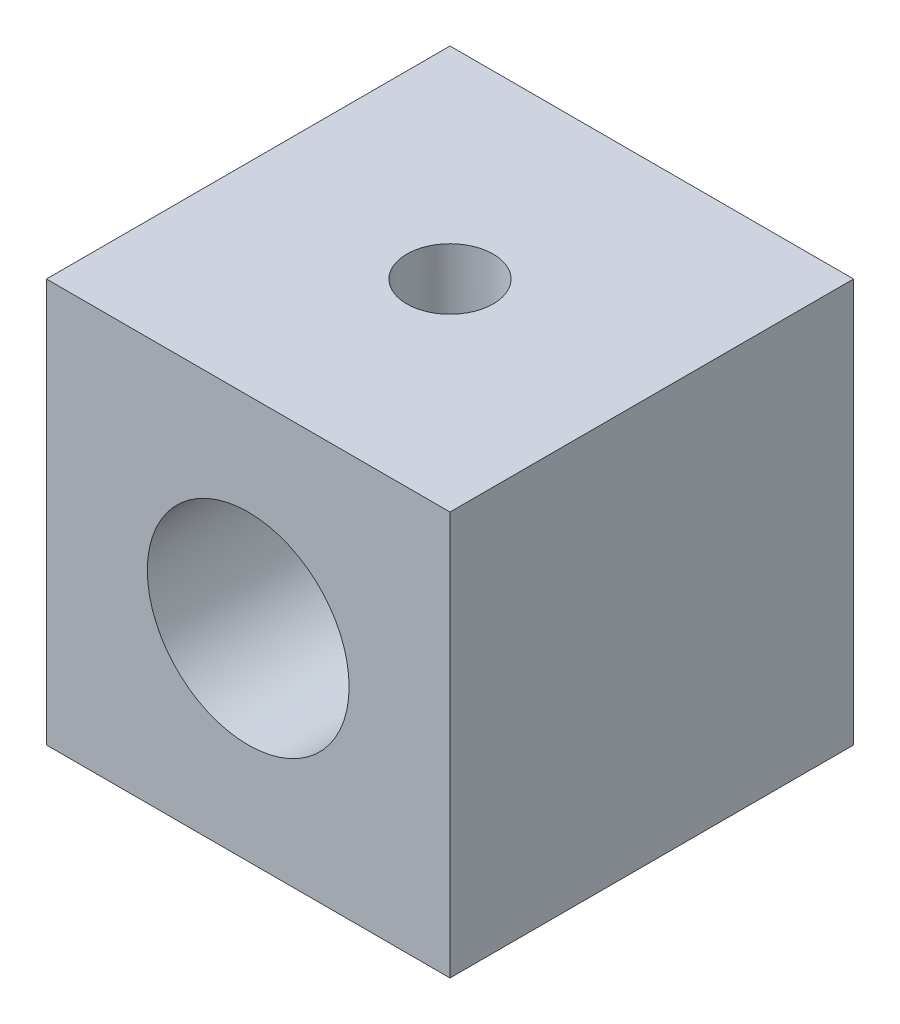
ISO-10303-21;
HEADER;
FILE_DESCRIPTION(('STEP AP214'),'2;1');
FILE_NAME('part.step','',(''),(''),'','','');
FILE_SCHEMA(('AUTOMOTIVE_DESIGN { 1 0 10303 214 1 1 1 1 }'));
ENDSEC;
DATA;
#1=APPLICATION_CONTEXT('core data for automotive mechanical design processes');
#2=APPLICATION_PROTOCOL_DEFINITION('international standard','automotive_design',2000,#1);
#3=PRODUCT_CONTEXT('',#1,'mechanical');
#4=PRODUCT('Part','Part','',(#3));
#5=PRODUCT_RELATED_PRODUCT_CATEGORY('part','',(#4));
#6=PRODUCT_DEFINITION_FORMATION('','',#4);
#7=PRODUCT_DEFINITION_CONTEXT('part definition',#1,'design');
#8=PRODUCT_DEFINITION('design','',#6,#7);
#9=PRODUCT_DEFINITION_SHAPE('','',#8);
#10=(LENGTH_UNIT() NAMED_UNIT(*) SI_UNIT(.MILLI.,.METRE.));
#11=(NAMED_UNIT(*) PLANE_ANGLE_UNIT() SI_UNIT($,.RADIAN.));
#12=(NAMED_UNIT(*) SI_UNIT($,.STERADIAN.) SOLID_ANGLE_UNIT());
#13=UNCERTAINTY_MEASURE_WITH_UNIT(LENGTH_MEASURE(1.E-05),#10,'distance_accuracy_value','');
#14=(GEOMETRIC_REPRESENTATION_CONTEXT(3) GLOBAL_UNCERTAINTY_ASSIGNED_CONTEXT((#13)) GLOBAL_UNIT_ASSIGNED_CONTEXT((#10,
#11,#12)) REPRESENTATION_CONTEXT('',''));
#15=CARTESIAN_POINT('',(0.,0.,0.));
#16=DIRECTION('',(0.,0.,1.));
#17=DIRECTION('',(1.,0.,0.));
#18=AXIS2_PLACEMENT_3D('',#15,#16,#17);
#19=CARTESIAN_POINT('',(0.,0.,40.));
#20=DIRECTION('',(0.,0.,-1.));
#21=DIRECTION('',(-1.,0.,0.));
#22=AXIS2_PLACEMENT_3D('',#19,#20,#21);
#23=PLANE('',#22);
#24=DIRECTION('',(0.,-1.,0.));
#25=VECTOR('',#24,1.);
#26=CARTESIAN_POINT('',(-20.,20.,40.));
#27=LINE('',#26,#25);
#28=CARTESIAN_POINT('',(-20.,20.,40.));
#29=VERTEX_POINT('',#28);
#30=CARTESIAN_POINT('',(-20.,-20.,40.));
#31=VERTEX_POINT('',#30);
#32=EDGE_CURVE('E91',#29,#31,#27,.T.);
#33=ORIENTED_EDGE('',*,*,#32,.T.);
#34=DIRECTION('',(1.,0.,0.));
#35=VECTOR('',#34,1.);
#36=CARTESIAN_POINT('',(20.,-20.,40.));
#37=LINE('',#36,#35);
#38=CARTESIAN_POINT('',(20.,-20.,40.));
#39=VERTEX_POINT('',#38);
#40=EDGE_CURVE('E86',#31,#39,#37,.T.);
#41=ORIENTED_EDGE('',*,*,#40,.T.);
#42=DIRECTION('',(0.,1.,0.));
#43=VECTOR('',#42,1.);
#44=CARTESIAN_POINT('',(20.,20.,40.));
#45=LINE('',#44,#43);
#46=CARTESIAN_POINT('',(20.,20.,40.));
#47=VERTEX_POINT('',#46);
#48=EDGE_CURVE('E89',#39,#47,#45,.T.);
#49=ORIENTED_EDGE('',*,*,#48,.T.);
#50=DIRECTION('',(-1.,0.,0.));
#51=VECTOR('',#50,1.);
#52=CARTESIAN_POINT('',(20.,20.,40.));
#53=LINE('',#52,#51);
#54=EDGE_CURVE('E56',#47,#29,#53,.T.);
#55=ORIENTED_EDGE('',*,*,#54,.T.);
#56=EDGE_LOOP('',(#33,#41,#49,#55));
#57=FACE_BOUND('',#56,.T.);
#58=CARTESIAN_POINT('',(0.,0.,40.));
#59=DIRECTION('',(0.,0.,1.));
#60=DIRECTION('',(1.,0.,0.));
#61=AXIS2_PLACEMENT_3D('',#58,#59,#60);
#62=CIRCLE('',#61,10.);
#63=CARTESIAN_POINT('',(10.,0.,40.));
#64=VERTEX_POINT('',#63);
#65=EDGE_CURVE('E107',#64,#64,#62,.T.);
#66=ORIENTED_EDGE('',*,*,#65,.F.);
#67=EDGE_LOOP('',(#66));
#68=FACE_BOUND('',#67,.T.);
#69=ADVANCED_FACE('F33',(#57,#68),#23,.F.);
#70=CARTESIAN_POINT('',(0.,0.,0.));
#71=DIRECTION('',(0.,0.,-1.));
#72=DIRECTION('',(-1.,0.,0.));
#73=AXIS2_PLACEMENT_3D('',#70,#71,#72);
#74=PLANE('',#73);
#75=DIRECTION('',(0.,-1.,0.));
#76=VECTOR('',#75,1.);
#77=CARTESIAN_POINT('',(-20.,20.,0.));
#78=LINE('',#77,#76);
#79=CARTESIAN_POINT('',(-20.,20.,0.));
#80=VERTEX_POINT('',#79);
#81=CARTESIAN_POINT('',(-20.,-20.,0.));
#82=VERTEX_POINT('',#81);
#83=EDGE_CURVE('E104',#80,#82,#78,.T.);
#84=ORIENTED_EDGE('',*,*,#83,.F.);
#85=DIRECTION('',(-1.,0.,0.));
#86=VECTOR('',#85,1.);
#87=CARTESIAN_POINT('',(20.,20.,0.));
#88=LINE('',#87,#86);
#89=CARTESIAN_POINT('',(20.,20.,0.));
#90=VERTEX_POINT('',#89);
#91=EDGE_CURVE('E79',#90,#80,#88,.T.);
#92=ORIENTED_EDGE('',*,*,#91,.F.);
#93=DIRECTION('',(0.,1.,0.));
#94=VECTOR('',#93,1.);
#95=CARTESIAN_POINT('',(20.,20.,0.));
#96=LINE('',#95,#94);
#97=CARTESIAN_POINT('',(20.,-20.,0.));
#98=VERTEX_POINT('',#97);
#99=EDGE_CURVE('E73',#98,#90,#96,.T.);
#100=ORIENTED_EDGE('',*,*,#99,.F.);
#101=DIRECTION('',(1.,0.,0.));
#102=VECTOR('',#101,1.);
#103=CARTESIAN_POINT('',(20.,-20.,0.));
#104=LINE('',#103,#102);
#105=EDGE_CURVE('E95',#82,#98,#104,.T.);
#106=ORIENTED_EDGE('',*,*,#105,.F.);
#107=EDGE_LOOP('',(#84,#92,#100,#106));
#108=FACE_BOUND('',#107,.T.);
#109=CARTESIAN_POINT('',(0.,0.,0.));
#110=DIRECTION('',(0.,0.,1.));
#111=DIRECTION('',(1.,0.,0.));
#112=AXIS2_PLACEMENT_3D('',#109,#110,#111);
#113=CIRCLE('',#112,10.);
#114=CARTESIAN_POINT('',(10.,0.,0.));
#115=VERTEX_POINT('',#114);
#116=EDGE_CURVE('E163',#115,#115,#113,.T.);
#117=ORIENTED_EDGE('',*,*,#116,.T.);
#118=EDGE_LOOP('',(#117));
#119=FACE_BOUND('',#118,.T.);
#120=ADVANCED_FACE('F136',(#108,#119),#74,.T.);
#121=CARTESIAN_POINT('',(-20.,20.,40.));
#122=DIRECTION('',(1.,0.,0.));
#123=DIRECTION('',(0.,1.,0.));
#124=AXIS2_PLACEMENT_3D('',#121,#122,#123);
#125=PLANE('',#124);
#126=ORIENTED_EDGE('',*,*,#83,.T.);
#127=DIRECTION('',(0.,0.,-1.));
#128=VECTOR('',#127,1.);
#129=CARTESIAN_POINT('',(-20.,-20.,40.));
#130=LINE('',#129,#128);
#131=EDGE_CURVE('E11',#31,#82,#130,.T.);
#132=ORIENTED_EDGE('',*,*,#131,.F.);
#133=ORIENTED_EDGE('',*,*,#32,.F.);
#134=DIRECTION('',(0.,0.,-1.));
#135=VECTOR('',#134,1.);
#136=CARTESIAN_POINT('',(-20.,20.,40.));
#137=LINE('',#136,#135);
#138=EDGE_CURVE('E100',#29,#80,#137,.T.);
#139=ORIENTED_EDGE('',*,*,#138,.T.);
#140=EDGE_LOOP('',(#126,#132,#133,#139));
#141=FACE_BOUND('',#140,.T.);
#142=ADVANCED_FACE('F35',(#141),#125,.F.);
#143=CARTESIAN_POINT('',(20.,-20.,40.));
#144=DIRECTION('',(0.,1.,0.));
#145=DIRECTION('',(-1.,0.,0.));
#146=AXIS2_PLACEMENT_3D('',#143,#144,#145);
#147=PLANE('',#146);
#148=CARTESIAN_POINT('',(0.,-20.,20.));
#149=DIRECTION('',(0.,-1.,0.));
#150=DIRECTION('',(1.,0.,0.));
#151=AXIS2_PLACEMENT_3D('',#148,#149,#150);
#152=CIRCLE('',#151,4.28355343391435);
#153=CARTESIAN_POINT('',(4.28355343391435,-20.,20.));
#154=VERTEX_POINT('',#153);
#155=EDGE_CURVE('E156',#154,#154,#152,.T.);
#156=ORIENTED_EDGE('',*,*,#155,.F.);
#157=EDGE_LOOP('',(#156));
#158=FACE_BOUND('',#157,.T.);
#159=ORIENTED_EDGE('',*,*,#105,.T.);
#160=DIRECTION('',(0.,0.,-1.));
#161=VECTOR('',#160,1.);
#162=CARTESIAN_POINT('',(20.,-20.,40.));
#163=LINE('',#162,#161);
#164=EDGE_CURVE('E47',#39,#98,#163,.T.);
#165=ORIENTED_EDGE('',*,*,#164,.F.);
#166=ORIENTED_EDGE('',*,*,#40,.F.);
#167=ORIENTED_EDGE('',*,*,#131,.T.);
#168=EDGE_LOOP('',(#159,#165,#166,#167));
#169=FACE_BOUND('',#168,.T.);
#170=ADVANCED_FACE('F94',(#158,#169),#147,.F.);
#171=CARTESIAN_POINT('',(20.,20.,40.));
#172=DIRECTION('',(-1.,0.,0.));
#173=DIRECTION('',(0.,-1.,0.));
#174=AXIS2_PLACEMENT_3D('',#171,#172,#173);
#175=PLANE('',#174);
#176=ORIENTED_EDGE('',*,*,#99,.T.);
#177=DIRECTION('',(0.,0.,-1.));
#178=VECTOR('',#177,1.);
#179=CARTESIAN_POINT('',(20.,20.,40.));
#180=LINE('',#179,#178);
#181=EDGE_CURVE('E96',#47,#90,#180,.T.);
#182=ORIENTED_EDGE('',*,*,#181,.F.);
#183=ORIENTED_EDGE('',*,*,#48,.F.);
#184=ORIENTED_EDGE('',*,*,#164,.T.);
#185=EDGE_LOOP('',(#176,#182,#183,#184));
#186=FACE_BOUND('',#185,.T.);
#187=ADVANCED_FACE('F98',(#186),#175,.F.);
#188=CARTESIAN_POINT('',(20.,20.,40.));
#189=DIRECTION('',(0.,-1.,0.));
#190=DIRECTION('',(1.,0.,0.));
#191=AXIS2_PLACEMENT_3D('',#188,#189,#190);
#192=PLANE('',#191);
#193=CARTESIAN_POINT('',(0.,20.,20.));
#194=DIRECTION('',(0.,-1.,0.));
#195=DIRECTION('',(1.,0.,0.));
#196=AXIS2_PLACEMENT_3D('',#193,#194,#195);
#197=CIRCLE('',#196,4.28355343391435);
#198=CARTESIAN_POINT('',(4.28355343391434,20.,20.));
#199=VERTEX_POINT('',#198);
#200=EDGE_CURVE('E116',#199,#199,#197,.T.);
#201=ORIENTED_EDGE('',*,*,#200,.T.);
#202=EDGE_LOOP('',(#201));
#203=FACE_BOUND('',#202,.T.);
#204=ORIENTED_EDGE('',*,*,#91,.T.);
#205=ORIENTED_EDGE('',*,*,#138,.F.);
#206=ORIENTED_EDGE('',*,*,#54,.F.);
#207=ORIENTED_EDGE('',*,*,#181,.T.);
#208=EDGE_LOOP('',(#204,#205,#206,#207));
#209=FACE_BOUND('',#208,.T.);
#210=ADVANCED_FACE('F132',(#203,#209),#192,.F.);
#211=CARTESIAN_POINT('',(0.,0.,40.));
#212=DIRECTION('',(0.,0.,-1.));
#213=DIRECTION('',(-1.,0.,0.));
#214=AXIS2_PLACEMENT_3D('',#211,#212,#213);
#215=CYLINDRICAL_SURFACE('',#214,10.);
#216=CARTESIAN_POINT('',(4.28355343391434,9.03610369455778,20.));
#217=CARTESIAN_POINT('',(4.28355254150128,9.03610463577456,20.1139492685976));
#218=CARTESIAN_POINT('',(4.27899979129568,9.03826672519458,20.2279354825384));
#219=CARTESIAN_POINT('',(4.26083755572342,9.04684256635532,20.455071242686));
#220=CARTESIAN_POINT('',(4.24722237364994,9.05325899239139,20.568220217334));
#221=CARTESIAN_POINT('',(4.21104813085097,9.07014190478527,20.7930219289305));
#222=CARTESIAN_POINT('',(4.188470645432,9.08061673333261,20.9046710906413));
#223=CARTESIAN_POINT('',(4.13462482394832,9.10525915437745,21.12545252902));
#224=CARTESIAN_POINT('',(4.10335281801754,9.11942830605259,21.234583721768));
#225=CARTESIAN_POINT('',(3.99726110755911,9.16667558229989,21.5560864368087));
#226=CARTESIAN_POINT('',(3.90996694391725,9.20459234468771,21.7637797192217));
#227=CARTESIAN_POINT('',(3.70503055842242,9.28896905239238,22.1614123887734));
#228=CARTESIAN_POINT('',(3.58739431584678,9.335427313985,22.3513552638116));
#229=CARTESIAN_POINT('',(3.3168349747094,9.43507313444804,22.7208349466148));
#230=CARTESIAN_POINT('',(3.16222366851272,9.48849689809961,22.8990722164559));
#231=CARTESIAN_POINT('',(2.82550940518134,9.59414056520317,23.2281108789336));
#232=CARTESIAN_POINT('',(2.64339554362463,9.64635998163753,23.378901336719));
#233=CARTESIAN_POINT('',(2.34826856175012,9.72093818401654,23.5846604776946));
#234=CARTESIAN_POINT('',(2.24365101782086,9.7456742220771,23.6510634254123));
#235=CARTESIAN_POINT('',(2.0286510668241,9.79268381841295,23.7747533645903));
#236=CARTESIAN_POINT('',(1.91827105360286,9.81495838743367,23.8320441020467));
#237=CARTESIAN_POINT('',(1.69245595643973,9.85640787096194,23.9369951273547));
#238=CARTESIAN_POINT('',(1.57702047708708,9.87558254246032,23.9846546602639));
#239=CARTESIAN_POINT('',(1.34198698237064,9.91025571276673,24.0698295283784));
#240=CARTESIAN_POINT('',(1.22239111142768,9.92575607417587,24.1073500046851));
#241=CARTESIAN_POINT('',(0.986510528893644,9.95188958597976,24.1700964432463));
#242=CARTESIAN_POINT('',(0.870397832169832,9.96274105426903,24.1958786743985));
#243=CARTESIAN_POINT('',(0.636180723211088,9.98043374469157,24.2377173051217));
#244=CARTESIAN_POINT('',(0.518077233603626,9.98727677466279,24.2537780892527));
#245=CARTESIAN_POINT('',(0.280792328935207,9.99676204202956,24.2760007770453));
#246=CARTESIAN_POINT('',(0.161611085414159,9.99940493650063,24.2821642290619));
#247=CARTESIAN_POINT('',(-0.0768639938097661,10.0004155109531,24.2845234631098));
#248=CARTESIAN_POINT('',(-0.196157824644451,9.99878336801481,24.2807196580041));
#249=CARTESIAN_POINT('',(-0.426207565642007,9.99153230876311,24.2637546436536));
#250=CARTESIAN_POINT('',(-0.537017697946902,9.98617744065261,24.2512130726566));
#251=CARTESIAN_POINT('',(-0.75711163762171,9.97190937355728,24.2175855057188));
#252=CARTESIAN_POINT('',(-0.866394929506203,9.96299500150436,24.1964966929193));
#253=CARTESIAN_POINT('',(-1.19074784799952,9.93121897359178,24.120695031736));
#254=CARTESIAN_POINT('',(-1.40253990659254,9.90331687502628,24.0534303700632));
#255=CARTESIAN_POINT('',(-1.81474832660207,9.83621378849736,23.8866194420964));
#256=CARTESIAN_POINT('',(-2.01494101607113,9.79684643258596,23.7865949364346));
#257=CARTESIAN_POINT('',(-2.39626150936188,9.71062117070642,23.557560043115));
#258=CARTESIAN_POINT('',(-2.57738243138813,9.66376057615909,23.4285392448048));
#259=CARTESIAN_POINT('',(-2.92958832946398,9.56313328136134,23.1341482055656));
#260=CARTESIAN_POINT('',(-3.09894263746268,9.50911213537855,22.9667964104807));
#261=CARTESIAN_POINT('',(-3.40801739203213,9.40277490001416,22.6058861757436));
#262=CARTESIAN_POINT('',(-3.54772507218003,9.35045955335716,22.4123165046987));
#263=CARTESIAN_POINT('',(-3.73441877797407,9.27678956013737,22.1019721179312));
#264=CARTESIAN_POINT('',(-3.79367352496491,9.25265002590544,21.9930631492052));
#265=CARTESIAN_POINT('',(-3.90270602903224,9.20719129965776,21.7700554862013));
#266=CARTESIAN_POINT('',(-3.95248795064354,9.18587086954401,21.6559590999259));
#267=CARTESIAN_POINT('',(-4.04208403680723,9.1467999325001,21.4233490725554));
#268=CARTESIAN_POINT('',(-4.08189985084488,9.12904883490736,21.3048361661716));
#269=CARTESIAN_POINT('',(-4.1511091489072,9.09778750094829,21.0643161939027));
#270=CARTESIAN_POINT('',(-4.1805082418114,9.08427498277148,20.942311046781));
#271=CARTESIAN_POINT('',(-4.2269246884531,9.06276540292678,20.7040370759317));
#272=CARTESIAN_POINT('',(-4.24463979553078,9.05445939782933,20.5879317874251));
#273=CARTESIAN_POINT('',(-4.27047549807825,9.04230306237343,20.3544755694006));
#274=CARTESIAN_POINT('',(-4.27860050808479,9.03845068192848,20.2371252381247));
#275=CARTESIAN_POINT('',(-4.28516547698882,9.03534007023135,20.0021073638846));
#276=CARTESIAN_POINT('',(-4.28360661337667,9.03608128043109,19.8844398612253));
#277=CARTESIAN_POINT('',(-4.27082757907383,9.04212813451905,19.6497535997646));
#278=CARTESIAN_POINT('',(-4.25960773302271,9.04743362503299,19.5327348192971));
#279=CARTESIAN_POINT('',(-4.22876065471808,9.06189004744189,19.3083910249218));
#280=CARTESIAN_POINT('',(-4.20977354218434,9.07074735322713,19.2009585897762));
#281=CARTESIAN_POINT('',(-4.16376016061469,9.09195986031683,18.9881705082104));
#282=CARTESIAN_POINT('',(-4.13673127065954,9.10431620193888,18.8828155508217));
#283=CARTESIAN_POINT('',(-4.04394524219859,9.1461014727907,18.5709093459103));
#284=CARTESIAN_POINT('',(-3.96646525952467,9.18025835562716,18.3683487784926));
#285=CARTESIAN_POINT('',(-3.77881441404367,9.25911949732409,17.9702227829743));
#286=CARTESIAN_POINT('',(-3.66736915896991,9.30421762726989,17.775343943477));
#287=CARTESIAN_POINT('',(-3.4161582123347,9.39935529227091,17.4060504424755));
#288=CARTESIAN_POINT('',(-3.27637978874423,9.44939704363221,17.2316450369211));
#289=CARTESIAN_POINT('',(-2.95820878555134,9.55402627722139,16.8925056173869));
#290=CARTESIAN_POINT('',(-2.77751517120271,9.60863059246691,16.7299319304827));
#291=CARTESIAN_POINT('',(-2.390037138795,9.71224938477699,16.4369338555285));
#292=CARTESIAN_POINT('',(-2.18325012418843,9.76126330461733,16.3065126707859));
#293=CARTESIAN_POINT('',(-1.85699451344475,9.82670134275143,16.1379337063668));
#294=CARTESIAN_POINT('',(-1.74520140029418,9.8472164656991,16.0861344769398));
#295=CARTESIAN_POINT('',(-1.51710039831909,9.8849244978357,15.9922048965828));
#296=CARTESIAN_POINT('',(-1.40079449201688,9.90211884647207,15.9500703548326));
#297=CARTESIAN_POINT('',(-1.16455043512274,9.93267395382961,15.8759266177867));
#298=CARTESIAN_POINT('',(-1.04461337133921,9.94603584730942,15.843914425058));
#299=CARTESIAN_POINT('',(-0.802032858615299,9.96852911662383,15.7903687624319));
#300=CARTESIAN_POINT('',(-0.679389628054912,9.97766083252327,15.7688344502086));
#301=CARTESIAN_POINT('',(-0.441512919836334,9.99090594062506,15.7376986165414));
#302=CARTESIAN_POINT('',(-0.326396007443095,9.99533837362811,15.727337499636));
#303=CARTESIAN_POINT('',(-0.0955746621994168,10.0002096497147,15.7159539720123));
#304=CARTESIAN_POINT('',(0.0201299547319194,10.0006471530344,15.7149346942293));
#305=CARTESIAN_POINT('',(0.251122536526533,9.99751331461403,15.7222537246028));
#306=CARTESIAN_POINT('',(0.366410697383371,9.99394420309689,15.7305868268943));
#307=CARTESIAN_POINT('',(0.595792875539279,9.98289649526428,15.7565121181176));
#308=CARTESIAN_POINT('',(0.709886432578192,9.97541644485576,15.7741077508887));
#309=CARTESIAN_POINT('',(0.931520465804009,9.95711485034779,15.8174961774183));
#310=CARTESIAN_POINT('',(1.03914170847017,9.94643707095149,15.8429374738556));
#311=CARTESIAN_POINT('',(1.25177849826651,9.92192181005939,15.9019426176595));
#312=CARTESIAN_POINT('',(1.35679312049423,9.90808322429872,15.9355093039725));
#313=CARTESIAN_POINT('',(1.66688492141917,9.86230171923801,16.0479655896301));
#314=CARTESIAN_POINT('',(1.86719226588156,9.8260772014503,16.138647523849));
#315=CARTESIAN_POINT('',(2.25901188917094,9.74365782838373,16.3533656321934));
#316=CARTESIAN_POINT('',(2.44970607752225,9.69708352038047,16.478734685223));
#317=CARTESIAN_POINT('',(2.8082097818536,9.5994011552722,16.7574172311109));
#318=CARTESIAN_POINT('',(2.97601020687741,9.5482913103556,16.9107417687627));
#319=CARTESIAN_POINT('',(3.2965937992733,9.44261656212154,17.2540174783853));
#320=CARTESIAN_POINT('',(3.44740435625679,9.38807000008464,17.4458188485485));
#321=CARTESIAN_POINT('',(3.71509220132573,9.28540431951917,17.8537595721704));
#322=CARTESIAN_POINT('',(3.83194975746225,9.23728894724213,18.0699129770811));
#323=CARTESIAN_POINT('',(3.97857899505551,9.17462325553835,18.4078766929609));
#324=CARTESIAN_POINT('',(4.0226702985026,9.15532361450867,18.5227837013051));
#325=CARTESIAN_POINT('',(4.10092848394615,9.12053868580882,18.7564695384072));
#326=CARTESIAN_POINT('',(4.1351002768348,9.10505151126457,18.8752464187853));
#327=CARTESIAN_POINT('',(4.19304565138067,9.07851209438885,19.1154488405315));
#328=CARTESIAN_POINT('',(4.2168466200353,9.06744817769511,19.2368665058229));
#329=CARTESIAN_POINT('',(4.25386457903965,9.05014139109451,19.481582912055));
#330=CARTESIAN_POINT('',(4.26708968234119,9.04389482583502,19.6048801370095));
#331=CARTESIAN_POINT('',(4.27781238455688,9.0388233033563,19.7737172692345));
#332=CARTESIAN_POINT('',(4.27996455404233,9.03780425383041,19.8189385720526));
#333=CARTESIAN_POINT('',(4.28283526742144,9.03644425702852,19.9094379710588));
#334=CARTESIAN_POINT('',(4.28355378856315,9.03610332051416,19.9547160681368));
#335=CARTESIAN_POINT('',(4.28355343391434,9.03610369455778,20.));
#336=B_SPLINE_CURVE_WITH_KNOTS('',3,(#216,#217,#218,#219,#220,#221,#222,#223,#224,#225,#226,
#227,#228,#229,#230,#231,#232,#233,#234,#235,#236,#237,#238,#239,#240,#241,#242,#243,#244,#245,
#246,#247,#248,#249,#250,#251,#252,#253,#254,#255,#256,#257,#258,#259,#260,#261,#262,#263,#264,
#265,#266,#267,#268,#269,#270,#271,#272,#273,#274,#275,#276,#277,#278,#279,#280,#281,#282,#283,
#284,#285,#286,#287,#288,#289,#290,#291,#292,#293,#294,#295,#296,#297,#298,#299,#300,#301,#302,
#303,#304,#305,#306,#307,#308,#309,#310,#311,#312,#313,#314,#315,#316,#317,#318,#319,#320,#321,
#322,#323,#324,#325,#326,#327,#328,#329,#330,#331,#332,#333,#334,#335),.UNSPECIFIED.,.T.,.F.,(4,
2,2,2,2,2,2,2,2,2,2,2,2,2,2,2,2,2,2,2,2,2,2,2,2,2,2,2,2,2,2,2,2,2,2,2,2,2,2,2,2,2,2,2,2,2,2,2,2,
2,2,2,2,2,2,2,2,2,2,4),(0.,0.341800495893717,0.683816053091659,1.02653839739954,
1.36940562141157,2.05148848372625,2.7334370358365,3.45612516339166,4.17910058377898,
4.55776713743774,4.9362776180591,5.31481775674582,5.69316559148648,6.05100109198962,
6.40867508129518,6.76629311003488,7.12389632578354,7.45842466040862,7.79306333311541,
8.46168848097236,9.14054529267474,9.81964622747926,10.5489303642574,11.2785279107387,
11.6570580687101,12.0354214271733,12.4137221214446,12.7918188091889,13.1445763298906,
13.497171404987,13.8497236078617,14.2022639643292,14.5302457684145,14.8583345833215,
15.5140082002512,16.1981771047771,16.8826541374547,17.6266608540885,18.3707416651085,
18.7450490360336,19.1191937909527,19.4932276500351,19.8672314352391,20.2137941712141,
20.5604731283038,20.9069592073145,21.25357420208,21.5864886540903,21.9195195920628,
22.585028708959,23.2808979353393,23.9770426873292,24.7236908026637,25.4707719721601,
25.8440888257589,26.2172205434298,26.5893608431499,26.9612153922246,27.0970462310421,
27.2328792254735),.UNSPECIFIED.);
#337=CARTESIAN_POINT('',(4.28355343391434,9.03610369455778,20.));
#338=VERTEX_POINT('',#337);
#339=EDGE_CURVE('E37',#338,#338,#336,.T.);
#340=ORIENTED_EDGE('',*,*,#339,.F.);
#341=EDGE_LOOP('',(#340));
#342=FACE_BOUND('',#341,.T.);
#343=CARTESIAN_POINT('',(4.28355343391435,-9.03610369455777,20.));
#344=CARTESIAN_POINT('',(4.28355254150128,-9.03610463577455,19.8860507314024));
#345=CARTESIAN_POINT('',(4.27899979129568,-9.03826672519458,19.7720645174616));
#346=CARTESIAN_POINT('',(4.26083755572342,-9.04684256635532,19.544928757314));
#347=CARTESIAN_POINT('',(4.24722237364994,-9.05325899239139,19.431779782666));
#348=CARTESIAN_POINT('',(4.21104813085098,-9.07014190478527,19.2069780710695));
#349=CARTESIAN_POINT('',(4.18847064543201,-9.08061673333261,19.0953289093587));
#350=CARTESIAN_POINT('',(4.13462482394833,-9.10525915437745,18.87454747098));
#351=CARTESIAN_POINT('',(4.10335281801754,-9.11942830605258,18.765416278232));
#352=CARTESIAN_POINT('',(3.99726110755911,-9.16667558229989,18.4439135631913));
#353=CARTESIAN_POINT('',(3.90996694391725,-9.20459234468771,18.2362202807783));
#354=CARTESIAN_POINT('',(3.70503055842242,-9.28896905239238,17.8385876112266));
#355=CARTESIAN_POINT('',(3.58739431584678,-9.335427313985,17.6486447361884));
#356=CARTESIAN_POINT('',(3.3168349747094,-9.43507313444804,17.2791650533852));
#357=CARTESIAN_POINT('',(3.16222366851272,-9.48849689809961,17.1009277835441));
#358=CARTESIAN_POINT('',(2.82550940518134,-9.59414056520317,16.7718891210664));
#359=CARTESIAN_POINT('',(2.64339554362463,-9.64635998163753,16.621098663281));
#360=CARTESIAN_POINT('',(2.34826856175012,-9.72093818401654,16.4153395223054));
#361=CARTESIAN_POINT('',(2.24365101782087,-9.74567422207709,16.3489365745877));
#362=CARTESIAN_POINT('',(2.0286510668241,-9.79268381841295,16.2252466354097));
#363=CARTESIAN_POINT('',(1.91827105360287,-9.81495838743367,16.1679558979533));
#364=CARTESIAN_POINT('',(1.69245595643974,-9.85640787096195,16.0630048726453));
#365=CARTESIAN_POINT('',(1.57702047708709,-9.87558254246032,16.0153453397361));
#366=CARTESIAN_POINT('',(1.34198698237064,-9.91025571276673,15.9301704716216));
#367=CARTESIAN_POINT('',(1.22239111142769,-9.92575607417587,15.8926499953149));
#368=CARTESIAN_POINT('',(0.98651052889365,-9.95188958597976,15.8299035567537));
#369=CARTESIAN_POINT('',(0.870397832169838,-9.96274105426903,15.8041213256015));
#370=CARTESIAN_POINT('',(0.636180723211094,-9.98043374469157,15.7622826948783));
#371=CARTESIAN_POINT('',(0.518077233603631,-9.98727677466279,15.7462219107473));
#372=CARTESIAN_POINT('',(0.280792328935212,-9.99676204202956,15.7239992229547));
#373=CARTESIAN_POINT('',(0.161611085414164,-9.99940493650063,15.7178357709381));
#374=CARTESIAN_POINT('',(-0.0768639938097616,-10.0004155109531,15.7154765368902));
#375=CARTESIAN_POINT('',(-0.196157824644447,-9.99878336801481,15.7192803419959));
#376=CARTESIAN_POINT('',(-0.426207565642003,-9.99153230876311,15.7362453563464));
#377=CARTESIAN_POINT('',(-0.537017697946898,-9.98617744065261,15.7487869273434));
#378=CARTESIAN_POINT('',(-0.757111637621707,-9.97190937355728,15.7824144942812));
#379=CARTESIAN_POINT('',(-0.8663949295062,-9.96299500150436,15.8035033070807));
#380=CARTESIAN_POINT('',(-1.19074784799952,-9.93121897359178,15.879304968264));
#381=CARTESIAN_POINT('',(-1.40253990659253,-9.90331687502628,15.9465696299368));
#382=CARTESIAN_POINT('',(-1.81474832660207,-9.83621378849736,16.1133805579036));
#383=CARTESIAN_POINT('',(-2.01494101607112,-9.79684643258597,16.2134050635655));
#384=CARTESIAN_POINT('',(-2.39626150936188,-9.71062117070643,16.442439956885));
#385=CARTESIAN_POINT('',(-2.57738243138813,-9.66376057615909,16.5714607551952));
#386=CARTESIAN_POINT('',(-2.92958832946398,-9.56313328136134,16.8658517944344));
#387=CARTESIAN_POINT('',(-3.09894263746268,-9.50911213537855,17.0332035895193));
#388=CARTESIAN_POINT('',(-3.40801739203213,-9.40277490001416,17.3941138242564));
#389=CARTESIAN_POINT('',(-3.54772507218003,-9.35045955335716,17.5876834953013));
#390=CARTESIAN_POINT('',(-3.73441877797407,-9.27678956013737,17.8980278820688));
#391=CARTESIAN_POINT('',(-3.79367352496491,-9.25265002590544,18.0069368507949));
#392=CARTESIAN_POINT('',(-3.90270602903224,-9.20719129965776,18.2299445137987));
#393=CARTESIAN_POINT('',(-3.95248795064354,-9.18587086954401,18.3440409000741));
#394=CARTESIAN_POINT('',(-4.04208403680723,-9.14679993250011,18.5766509274446));
#395=CARTESIAN_POINT('',(-4.08189985084488,-9.12904883490736,18.6951638338284));
#396=CARTESIAN_POINT('',(-4.1511091489072,-9.09778750094829,18.9356838060973));
#397=CARTESIAN_POINT('',(-4.1805082418114,-9.08427498277149,19.057688953219));
#398=CARTESIAN_POINT('',(-4.22692468845309,-9.06276540292678,19.2959629240683));
#399=CARTESIAN_POINT('',(-4.24463979553077,-9.05445939782933,19.4120682125749));
#400=CARTESIAN_POINT('',(-4.27047549807824,-9.04230306237343,19.6455244305994));
#401=CARTESIAN_POINT('',(-4.27860050808479,-9.03845068192848,19.7628747618753));
#402=CARTESIAN_POINT('',(-4.28516547698881,-9.03534007023135,19.9978926361154));
#403=CARTESIAN_POINT('',(-4.28360661337667,-9.03608128043109,20.1155601387747));
#404=CARTESIAN_POINT('',(-4.27082757907383,-9.04212813451905,20.3502464002354));
#405=CARTESIAN_POINT('',(-4.25960773302271,-9.04743362503299,20.4672651807029));
#406=CARTESIAN_POINT('',(-4.22876065471807,-9.06189004744189,20.6916089750782));
#407=CARTESIAN_POINT('',(-4.20977354218434,-9.07074735322714,20.7990414102238));
#408=CARTESIAN_POINT('',(-4.16376016061469,-9.09195986031683,21.0118294917896));
#409=CARTESIAN_POINT('',(-4.13673127065954,-9.10431620193888,21.1171844491783));
#410=CARTESIAN_POINT('',(-4.04394524219858,-9.1461014727907,21.4290906540897));
#411=CARTESIAN_POINT('',(-3.96646525952466,-9.18025835562716,21.6316512215074));
#412=CARTESIAN_POINT('',(-3.77881441404367,-9.25911949732409,22.0297772170257));
#413=CARTESIAN_POINT('',(-3.6673691589699,-9.30421762726989,22.224656056523));
#414=CARTESIAN_POINT('',(-3.41615821233469,-9.39935529227091,22.5939495575245));
#415=CARTESIAN_POINT('',(-3.27637978874422,-9.44939704363221,22.7683549630789));
#416=CARTESIAN_POINT('',(-2.95820878555133,-9.55402627722139,23.1074943826131));
#417=CARTESIAN_POINT('',(-2.77751517120271,-9.60863059246691,23.2700680695173));
#418=CARTESIAN_POINT('',(-2.390037138795,-9.71224938477699,23.5630661444715));
#419=CARTESIAN_POINT('',(-2.18325012418843,-9.76126330461734,23.6934873292141));
#420=CARTESIAN_POINT('',(-1.85699451344475,-9.82670134275143,23.8620662936332));
#421=CARTESIAN_POINT('',(-1.74520140029418,-9.8472164656991,23.9138655230602));
#422=CARTESIAN_POINT('',(-1.51710039831909,-9.8849244978357,24.0077951034172));
#423=CARTESIAN_POINT('',(-1.40079449201688,-9.90211884647207,24.0499296451674));
#424=CARTESIAN_POINT('',(-1.16455043512274,-9.93267395382961,24.1240733822133));
#425=CARTESIAN_POINT('',(-1.04461337133921,-9.94603584730942,24.156085574942));
#426=CARTESIAN_POINT('',(-0.802032858615297,-9.96852911662383,24.209631237568));
#427=CARTESIAN_POINT('',(-0.679389628054909,-9.97766083252327,24.2311655497914));
#428=CARTESIAN_POINT('',(-0.441512919836332,-9.99090594062506,24.2623013834586));
#429=CARTESIAN_POINT('',(-0.326396007443094,-9.99533837362811,24.272662500364));
#430=CARTESIAN_POINT('',(-0.0955746621994145,-10.0002096497147,24.2840460279877));
#431=CARTESIAN_POINT('',(0.0201299547319229,-10.0006471530344,24.2850653057707));
#432=CARTESIAN_POINT('',(0.251122536526537,-9.99751331461403,24.2777462753972));
#433=CARTESIAN_POINT('',(0.366410697383376,-9.99394420309689,24.2694131731057));
#434=CARTESIAN_POINT('',(0.595792875539284,-9.98289649526427,24.2434878818824));
#435=CARTESIAN_POINT('',(0.709886432578196,-9.97541644485576,24.2258922491113));
#436=CARTESIAN_POINT('',(0.931520465804013,-9.95711485034779,24.1825038225817));
#437=CARTESIAN_POINT('',(1.03914170847017,-9.94643707095149,24.1570625261444));
#438=CARTESIAN_POINT('',(1.25177849826651,-9.92192181005939,24.0980573823405));
#439=CARTESIAN_POINT('',(1.35679312049423,-9.90808322429872,24.0644906960275));
#440=CARTESIAN_POINT('',(1.66688492141918,-9.86230171923801,23.9520344103699));
#441=CARTESIAN_POINT('',(1.86719226588156,-9.8260772014503,23.861352476151));
#442=CARTESIAN_POINT('',(2.25901188917094,-9.74365782838373,23.6466343678066));
#443=CARTESIAN_POINT('',(2.44970607752225,-9.69708352038047,23.521265314777));
#444=CARTESIAN_POINT('',(2.8082097818536,-9.59940115527219,23.2425827688891));
#445=CARTESIAN_POINT('',(2.97601020687741,-9.5482913103556,23.0892582312373));
#446=CARTESIAN_POINT('',(3.2965937992733,-9.44261656212153,22.7459825216147));
#447=CARTESIAN_POINT('',(3.4474043562568,-9.38807000008464,22.5541811514515));
#448=CARTESIAN_POINT('',(3.71509220132573,-9.28540431951917,22.1462404278296));
#449=CARTESIAN_POINT('',(3.83194975746226,-9.23728894724213,21.9300870229189));
#450=CARTESIAN_POINT('',(3.97857899505551,-9.17462325553835,21.5921233070391));
#451=CARTESIAN_POINT('',(4.02267029850261,-9.15532361450867,21.4772162986949));
#452=CARTESIAN_POINT('',(4.10092848394615,-9.12053868580882,21.2435304615928));
#453=CARTESIAN_POINT('',(4.13510027683481,-9.10505151126457,21.1247535812147));
#454=CARTESIAN_POINT('',(4.19304565138068,-9.07851209438885,20.8845511594685));
#455=CARTESIAN_POINT('',(4.21684662003531,-9.06744817769511,20.7631334941771));
#456=CARTESIAN_POINT('',(4.25386457903965,-9.05014139109451,20.518417087945));
#457=CARTESIAN_POINT('',(4.2670896823412,-9.04389482583502,20.3951198629905));
#458=CARTESIAN_POINT('',(4.27781238455689,-9.0388233033563,20.2262827307655));
#459=CARTESIAN_POINT('',(4.27996455404234,-9.03780425383041,20.1810614279474));
#460=CARTESIAN_POINT('',(4.28283526742145,-9.03644425702852,20.0905620289412));
#461=CARTESIAN_POINT('',(4.28355378856316,-9.03610332051415,20.0452839318632));
#462=CARTESIAN_POINT('',(4.28355343391435,-9.03610369455777,20.));
#463=B_SPLINE_CURVE_WITH_KNOTS('',3,(#343,#344,#345,#346,#347,#348,#349,#350,#351,#352,#353,
#354,#355,#356,#357,#358,#359,#360,#361,#362,#363,#364,#365,#366,#367,#368,#369,#370,#371,#372,
#373,#374,#375,#376,#377,#378,#379,#380,#381,#382,#383,#384,#385,#386,#387,#388,#389,#390,#391,
#392,#393,#394,#395,#396,#397,#398,#399,#400,#401,#402,#403,#404,#405,#406,#407,#408,#409,#410,
#411,#412,#413,#414,#415,#416,#417,#418,#419,#420,#421,#422,#423,#424,#425,#426,#427,#428,#429,
#430,#431,#432,#433,#434,#435,#436,#437,#438,#439,#440,#441,#442,#443,#444,#445,#446,#447,#448,
#449,#450,#451,#452,#453,#454,#455,#456,#457,#458,#459,#460,#461,#462),.UNSPECIFIED.,.T.,.F.,(4,
2,2,2,2,2,2,2,2,2,2,2,2,2,2,2,2,2,2,2,2,2,2,2,2,2,2,2,2,2,2,2,2,2,2,2,2,2,2,2,2,2,2,2,2,2,2,2,2,
2,2,2,2,2,2,2,2,2,2,4),(0.,0.341800495893717,0.683816053091662,1.02653839739954,
1.36940562141157,2.05148848372625,2.7334370358365,3.45612516339166,4.17910058377898,
4.55776713743773,4.9362776180591,5.31481775674582,5.69316559148647,6.05100109198962,
6.40867508129518,6.76629311003488,7.12389632578354,7.45842466040863,7.79306333311541,
8.46168848097237,9.14054529267474,9.81964622747926,10.5489303642574,11.2785279107387,
11.6570580687101,12.0354214271733,12.4137221214446,12.791818809189,13.1445763298907,
13.497171404987,13.8497236078617,14.2022639643292,14.5302457684145,14.8583345833215,
15.5140082002512,16.1981771047772,16.8826541374547,17.6266608540885,18.3707416651085,
18.7450490360336,19.1191937909527,19.4932276500351,19.8672314352391,20.2137941712141,
20.5604731283038,20.9069592073145,21.25357420208,21.5864886540903,21.9195195920628,
22.585028708959,23.2808979353393,23.9770426873292,24.7236908026637,25.4707719721601,
25.8440888257589,26.2172205434299,26.5893608431499,26.9612153922246,27.0970462310421,
27.2328792254735),.UNSPECIFIED.);
#464=CARTESIAN_POINT('',(4.28355343391435,-9.03610369455777,20.));
#465=VERTEX_POINT('',#464);
#466=EDGE_CURVE('E112',#465,#465,#463,.T.);
#467=ORIENTED_EDGE('',*,*,#466,.F.);
#468=EDGE_LOOP('',(#467));
#469=FACE_BOUND('',#468,.T.);
#470=ORIENTED_EDGE('',*,*,#65,.T.);
#471=EDGE_LOOP('',(#470));
#472=FACE_BOUND('',#471,.T.);
#473=ORIENTED_EDGE('',*,*,#116,.F.);
#474=EDGE_LOOP('',(#473));
#475=FACE_BOUND('',#474,.T.);
#476=ADVANCED_FACE('F117',(#342,#469,#472,#475),#215,.F.);
#477=CARTESIAN_POINT('',(0.,20.,20.));
#478=DIRECTION('',(0.,-1.,0.));
#479=DIRECTION('',(1.,0.,0.));
#480=AXIS2_PLACEMENT_3D('',#477,#478,#479);
#481=CYLINDRICAL_SURFACE('',#480,4.28355343391435);
#482=ORIENTED_EDGE('',*,*,#466,.T.);
#483=EDGE_LOOP('',(#482));
#484=FACE_BOUND('',#483,.T.);
#485=ORIENTED_EDGE('',*,*,#155,.T.);
#486=EDGE_LOOP('',(#485));
#487=FACE_BOUND('',#486,.T.);
#488=ADVANCED_FACE('F120',(#484,#487),#481,.F.);
#489=ORIENTED_EDGE('',*,*,#339,.T.);
#490=EDGE_LOOP('',(#489));
#491=FACE_BOUND('',#490,.T.);
#492=ORIENTED_EDGE('',*,*,#200,.F.);
#493=EDGE_LOOP('',(#492));
#494=FACE_BOUND('',#493,.T.);
#495=ADVANCED_FACE('F123',(#491,#494),#481,.F.);
#496=CLOSED_SHELL('',(#69,#120,#142,#170,#187,#210,#476,#488,#495));
#497=MANIFOLD_SOLID_BREP('B2',#496);
#498=ADVANCED_BREP_SHAPE_REPRESENTATION('',(#18,#497),#14);
#499=SHAPE_DEFINITION_REPRESENTATION(#9,#498);
ENDSEC;
END-ISO-10303-21;
